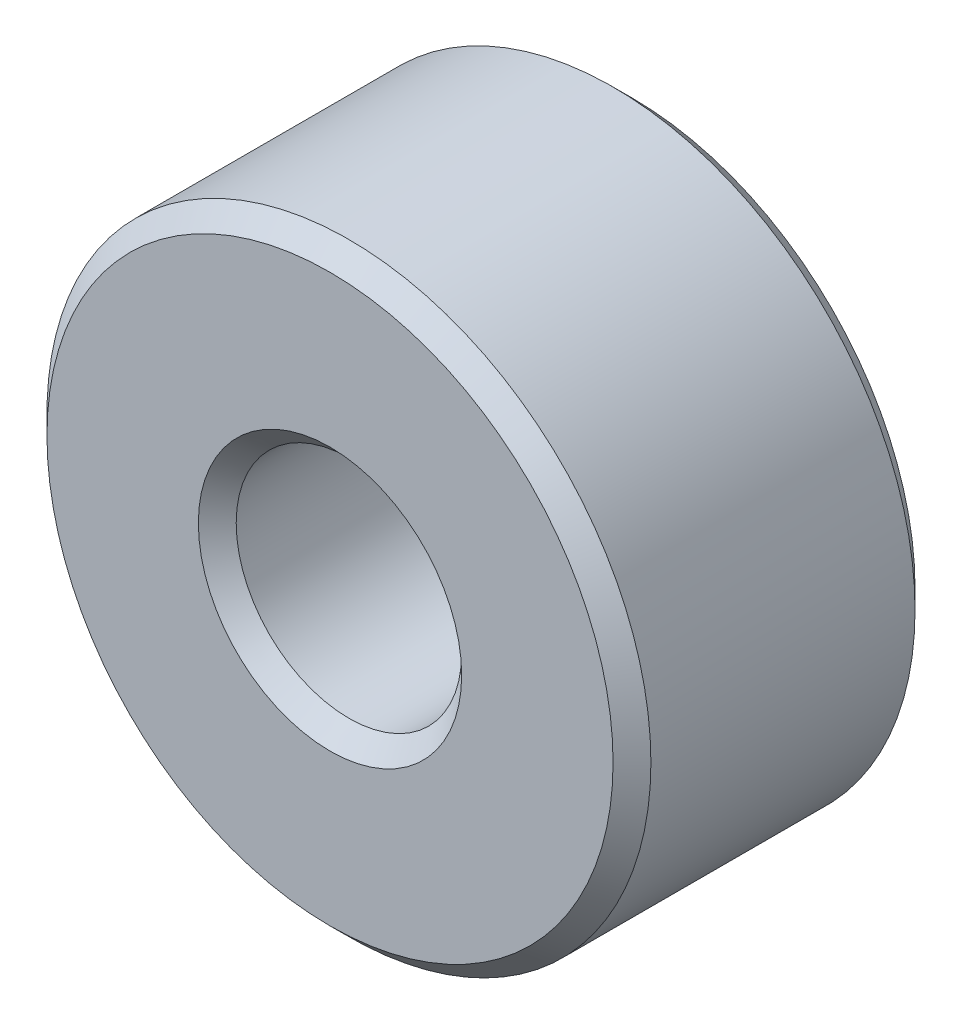
ISO-10303-21;
HEADER;
FILE_DESCRIPTION(('STEP AP214'),'2;1');
FILE_NAME('part.step','',(''),(''),'','','');
FILE_SCHEMA(('AUTOMOTIVE_DESIGN { 1 0 10303 214 1 1 1 1 }'));
ENDSEC;
DATA;
#1=APPLICATION_CONTEXT('core data for automotive mechanical design processes');
#2=APPLICATION_PROTOCOL_DEFINITION('international standard','automotive_design',2000,#1);
#3=PRODUCT_CONTEXT('',#1,'mechanical');
#4=PRODUCT('Part','Part','',(#3));
#5=PRODUCT_RELATED_PRODUCT_CATEGORY('part','',(#4));
#6=PRODUCT_DEFINITION_FORMATION('','',#4);
#7=PRODUCT_DEFINITION_CONTEXT('part definition',#1,'design');
#8=PRODUCT_DEFINITION('design','',#6,#7);
#9=PRODUCT_DEFINITION_SHAPE('','',#8);
#10=(LENGTH_UNIT() NAMED_UNIT(*) SI_UNIT(.MILLI.,.METRE.));
#11=(NAMED_UNIT(*) PLANE_ANGLE_UNIT() SI_UNIT($,.RADIAN.));
#12=(NAMED_UNIT(*) SI_UNIT($,.STERADIAN.) SOLID_ANGLE_UNIT());
#13=UNCERTAINTY_MEASURE_WITH_UNIT(LENGTH_MEASURE(1.E-05),#10,'distance_accuracy_value','');
#14=(GEOMETRIC_REPRESENTATION_CONTEXT(3) GLOBAL_UNCERTAINTY_ASSIGNED_CONTEXT((#13)) GLOBAL_UNIT_ASSIGNED_CONTEXT((#10,
#11,#12)) REPRESENTATION_CONTEXT('',''));
#15=CARTESIAN_POINT('',(0.,0.,0.));
#16=DIRECTION('',(0.,0.,1.));
#17=DIRECTION('',(1.,0.,0.));
#18=AXIS2_PLACEMENT_3D('',#15,#16,#17);
#19=CARTESIAN_POINT('',(0.,0.,-2.38125));
#20=DIRECTION('',(0.,0.,1.));
#21=DIRECTION('',(1.,0.,0.));
#22=AXIS2_PLACEMENT_3D('',#19,#20,#21);
#23=CYLINDRICAL_SURFACE('',#22,4.7625);
#24=CARTESIAN_POINT('',(0.,0.,2.0828));
#25=DIRECTION('',(0.,0.,1.));
#26=DIRECTION('',(1.,0.,0.));
#27=AXIS2_PLACEMENT_3D('',#24,#25,#26);
#28=CIRCLE('',#27,4.7625);
#29=CARTESIAN_POINT('',(4.7625,0.,2.0828));
#30=VERTEX_POINT('',#29);
#31=EDGE_CURVE('E65',#30,#30,#28,.F.);
#32=ORIENTED_EDGE('',*,*,#31,.T.);
#33=EDGE_LOOP('',(#32));
#34=FACE_BOUND('',#33,.T.);
#35=CARTESIAN_POINT('',(0.,0.,-2.0828));
#36=DIRECTION('',(0.,0.,1.));
#37=DIRECTION('',(1.,0.,0.));
#38=AXIS2_PLACEMENT_3D('',#35,#36,#37);
#39=CIRCLE('',#38,4.7625);
#40=CARTESIAN_POINT('',(4.7625,0.,-2.0828));
#41=VERTEX_POINT('',#40);
#42=EDGE_CURVE('E69',#41,#41,#39,.T.);
#43=ORIENTED_EDGE('',*,*,#42,.T.);
#44=EDGE_LOOP('',(#43));
#45=FACE_BOUND('',#44,.T.);
#46=ADVANCED_FACE('F39',(#34,#45),#23,.T.);
#47=CARTESIAN_POINT('',(0.,0.,-2.38125));
#48=DIRECTION('',(0.,0.,1.));
#49=DIRECTION('',(1.,0.,0.));
#50=AXIS2_PLACEMENT_3D('',#47,#48,#49);
#51=PLANE('',#50);
#52=CARTESIAN_POINT('',(0.,0.,-2.38125));
#53=DIRECTION('',(0.,0.,1.));
#54=DIRECTION('',(1.,0.,0.));
#55=AXIS2_PLACEMENT_3D('',#52,#53,#54);
#56=CIRCLE('',#55,4.46405);
#57=CARTESIAN_POINT('',(4.46405,0.,-2.38125));
#58=VERTEX_POINT('',#57);
#59=EDGE_CURVE('E53',#58,#58,#56,.F.);
#60=ORIENTED_EDGE('',*,*,#59,.T.);
#61=EDGE_LOOP('',(#60));
#62=FACE_BOUND('',#61,.T.);
#63=CARTESIAN_POINT('',(0.,0.,-2.38125));
#64=DIRECTION('',(0.,0.,1.));
#65=DIRECTION('',(1.,0.,0.));
#66=AXIS2_PLACEMENT_3D('',#63,#64,#65);
#67=CIRCLE('',#66,2.07645);
#68=CARTESIAN_POINT('',(-2.07645,0.,-2.38125));
#69=VERTEX_POINT('',#68);
#70=EDGE_CURVE('E59',#69,#69,#67,.T.);
#71=ORIENTED_EDGE('',*,*,#70,.T.);
#72=EDGE_LOOP('',(#71));
#73=FACE_BOUND('',#72,.T.);
#74=ADVANCED_FACE('F98',(#62,#73),#51,.F.);
#75=CARTESIAN_POINT('',(0.,0.,-2.38125));
#76=DIRECTION('',(0.,0.,1.));
#77=DIRECTION('',(1.,0.,0.));
#78=AXIS2_PLACEMENT_3D('',#75,#76,#77);
#79=CYLINDRICAL_SURFACE('',#78,1.778);
#80=CARTESIAN_POINT('',(0.,0.,2.0828));
#81=DIRECTION('',(0.,0.,1.));
#82=DIRECTION('',(1.,0.,0.));
#83=AXIS2_PLACEMENT_3D('',#80,#81,#82);
#84=CIRCLE('',#83,1.778);
#85=CARTESIAN_POINT('',(1.778,0.,2.0828));
#86=VERTEX_POINT('',#85);
#87=EDGE_CURVE('E10',#86,#86,#84,.T.);
#88=ORIENTED_EDGE('',*,*,#87,.T.);
#89=EDGE_LOOP('',(#88));
#90=FACE_BOUND('',#89,.T.);
#91=CARTESIAN_POINT('',(0.,0.,-2.0828));
#92=DIRECTION('',(0.,0.,1.));
#93=DIRECTION('',(1.,0.,0.));
#94=AXIS2_PLACEMENT_3D('',#91,#92,#93);
#95=CIRCLE('',#94,1.778);
#96=CARTESIAN_POINT('',(-1.778,0.,-2.0828));
#97=VERTEX_POINT('',#96);
#98=EDGE_CURVE('E47',#97,#97,#95,.F.);
#99=ORIENTED_EDGE('',*,*,#98,.T.);
#100=EDGE_LOOP('',(#99));
#101=FACE_BOUND('',#100,.T.);
#102=ADVANCED_FACE('F104',(#90,#101),#79,.F.);
#103=CARTESIAN_POINT('',(0.,0.,2.38125));
#104=DIRECTION('',(0.,0.,1.));
#105=DIRECTION('',(1.,0.,0.));
#106=AXIS2_PLACEMENT_3D('',#103,#104,#105);
#107=PLANE('',#106);
#108=CARTESIAN_POINT('',(0.,0.,2.38125));
#109=DIRECTION('',(0.,0.,1.));
#110=DIRECTION('',(1.,0.,0.));
#111=AXIS2_PLACEMENT_3D('',#108,#109,#110);
#112=CIRCLE('',#111,4.46405);
#113=CARTESIAN_POINT('',(4.46405,0.,2.38125));
#114=VERTEX_POINT('',#113);
#115=EDGE_CURVE('E73',#114,#114,#112,.T.);
#116=ORIENTED_EDGE('',*,*,#115,.T.);
#117=EDGE_LOOP('',(#116));
#118=FACE_BOUND('',#117,.T.);
#119=CARTESIAN_POINT('',(0.,0.,2.38125));
#120=DIRECTION('',(0.,0.,1.));
#121=DIRECTION('',(1.,0.,0.));
#122=AXIS2_PLACEMENT_3D('',#119,#120,#121);
#123=CIRCLE('',#122,2.07645);
#124=CARTESIAN_POINT('',(2.07645,0.,2.38125));
#125=VERTEX_POINT('',#124);
#126=EDGE_CURVE('E77',#125,#125,#123,.F.);
#127=ORIENTED_EDGE('',*,*,#126,.T.);
#128=EDGE_LOOP('',(#127));
#129=FACE_BOUND('',#128,.T.);
#130=ADVANCED_FACE('F83',(#118,#129),#107,.T.);
#131=CARTESIAN_POINT('',(0.,0.,2.38125));
#132=DIRECTION('',(0.,0.,-1.));
#133=DIRECTION('',(-1.,0.,0.));
#134=AXIS2_PLACEMENT_3D('',#131,#132,#133);
#135=CONICAL_SURFACE('',#134,4.46405,0.785398163397447);
#136=ORIENTED_EDGE('',*,*,#31,.F.);
#137=EDGE_LOOP('',(#136));
#138=FACE_BOUND('',#137,.T.);
#139=ORIENTED_EDGE('',*,*,#115,.F.);
#140=EDGE_LOOP('',(#139));
#141=FACE_BOUND('',#140,.T.);
#142=ADVANCED_FACE('F94',(#138,#141),#135,.T.);
#143=CARTESIAN_POINT('',(0.,0.,-2.0828));
#144=DIRECTION('',(0.,0.,1.));
#145=DIRECTION('',(1.,0.,0.));
#146=AXIS2_PLACEMENT_3D('',#143,#144,#145);
#147=CONICAL_SURFACE('',#146,4.7625,0.785398163397453);
#148=ORIENTED_EDGE('',*,*,#59,.F.);
#149=EDGE_LOOP('',(#148));
#150=FACE_BOUND('',#149,.T.);
#151=ORIENTED_EDGE('',*,*,#42,.F.);
#152=EDGE_LOOP('',(#151));
#153=FACE_BOUND('',#152,.T.);
#154=ADVANCED_FACE('F88',(#150,#153),#147,.T.);
#155=CARTESIAN_POINT('',(0.,0.,2.0828));
#156=DIRECTION('',(0.,0.,1.));
#157=DIRECTION('',(1.,0.,0.));
#158=AXIS2_PLACEMENT_3D('',#155,#156,#157);
#159=CONICAL_SURFACE('',#158,1.778,0.785398163397447);
#160=ORIENTED_EDGE('',*,*,#126,.F.);
#161=EDGE_LOOP('',(#160));
#162=FACE_BOUND('',#161,.T.);
#163=ORIENTED_EDGE('',*,*,#87,.F.);
#164=EDGE_LOOP('',(#163));
#165=FACE_BOUND('',#164,.T.);
#166=ADVANCED_FACE('F85',(#162,#165),#159,.F.);
#167=CARTESIAN_POINT('',(0.,0.,-2.38125));
#168=DIRECTION('',(0.,0.,-1.));
#169=DIRECTION('',(-1.,0.,0.));
#170=AXIS2_PLACEMENT_3D('',#167,#168,#169);
#171=CONICAL_SURFACE('',#170,2.07645,0.785398163397448);
#172=CARTESIAN_POINT('',(-1.778,0.,-2.0828));
#173=CARTESIAN_POINT('',(-1.78110885416667,0.,-2.08590885416667));
#174=CARTESIAN_POINT('',(-1.78421770833333,0.,-2.08901770833334));
#175=CARTESIAN_POINT('',(-1.79043541666667,0.,-2.09523541666667));
#176=CARTESIAN_POINT('',(-1.79354427083333,0.,-2.09834427083334));
#177=CARTESIAN_POINT('',(-1.79976197916667,0.,-2.10456197916667));
#178=CARTESIAN_POINT('',(-1.80287083333333,0.,-2.10767083333334));
#179=CARTESIAN_POINT('',(-1.80908854166667,0.,-2.11388854166667));
#180=CARTESIAN_POINT('',(-1.81219739583333,0.,-2.11699739583334));
#181=CARTESIAN_POINT('',(-1.81841510416667,0.,-2.12321510416667));
#182=CARTESIAN_POINT('',(-1.82152395833333,0.,-2.12632395833334));
#183=CARTESIAN_POINT('',(-1.82774166666667,0.,-2.13254166666667));
#184=CARTESIAN_POINT('',(-1.83085052083333,0.,-2.13565052083334));
#185=CARTESIAN_POINT('',(-1.83706822916667,0.,-2.14186822916667));
#186=CARTESIAN_POINT('',(-1.84017708333333,0.,-2.14497708333334));
#187=CARTESIAN_POINT('',(-1.84639479166667,0.,-2.15119479166667));
#188=CARTESIAN_POINT('',(-1.84950364583333,0.,-2.15430364583334));
#189=CARTESIAN_POINT('',(-1.85572135416667,0.,-2.16052135416667));
#190=CARTESIAN_POINT('',(-1.85883020833333,0.,-2.16363020833334));
#191=CARTESIAN_POINT('',(-1.86504791666667,0.,-2.16984791666667));
#192=CARTESIAN_POINT('',(-1.86815677083333,0.,-2.17295677083334));
#193=CARTESIAN_POINT('',(-1.87437447916667,0.,-2.17917447916667));
#194=CARTESIAN_POINT('',(-1.87748333333333,0.,-2.18228333333334));
#195=CARTESIAN_POINT('',(-1.88370104166667,0.,-2.18850104166667));
#196=CARTESIAN_POINT('',(-1.88680989583333,0.,-2.19160989583334));
#197=CARTESIAN_POINT('',(-1.89302760416667,0.,-2.19782760416667));
#198=CARTESIAN_POINT('',(-1.89613645833333,0.,-2.20093645833334));
#199=CARTESIAN_POINT('',(-1.90235416666667,0.,-2.20715416666667));
#200=CARTESIAN_POINT('',(-1.90546302083333,0.,-2.21026302083334));
#201=CARTESIAN_POINT('',(-1.91168072916667,0.,-2.21648072916667));
#202=CARTESIAN_POINT('',(-1.91478958333333,0.,-2.21958958333334));
#203=CARTESIAN_POINT('',(-1.92100729166667,0.,-2.22580729166667));
#204=CARTESIAN_POINT('',(-1.92411614583333,0.,-2.22891614583334));
#205=CARTESIAN_POINT('',(-1.93033385416667,0.,-2.23513385416667));
#206=CARTESIAN_POINT('',(-1.93344270833333,0.,-2.23824270833334));
#207=CARTESIAN_POINT('',(-1.93966041666667,0.,-2.24446041666667));
#208=CARTESIAN_POINT('',(-1.94276927083333,0.,-2.24756927083334));
#209=CARTESIAN_POINT('',(-1.94898697916667,0.,-2.25378697916667));
#210=CARTESIAN_POINT('',(-1.95209583333333,0.,-2.25689583333334));
#211=CARTESIAN_POINT('',(-1.95831354166667,0.,-2.26311354166667));
#212=CARTESIAN_POINT('',(-1.96142239583333,0.,-2.26622239583334));
#213=CARTESIAN_POINT('',(-1.96764010416667,0.,-2.27244010416667));
#214=CARTESIAN_POINT('',(-1.97074895833333,0.,-2.27554895833334));
#215=CARTESIAN_POINT('',(-1.97696666666667,0.,-2.28176666666667));
#216=CARTESIAN_POINT('',(-1.98007552083333,0.,-2.28487552083334));
#217=CARTESIAN_POINT('',(-1.98629322916667,0.,-2.29109322916667));
#218=CARTESIAN_POINT('',(-1.98940208333333,0.,-2.29420208333334));
#219=CARTESIAN_POINT('',(-1.99561979166667,0.,-2.30041979166667));
#220=CARTESIAN_POINT('',(-1.99872864583333,0.,-2.30352864583334));
#221=CARTESIAN_POINT('',(-2.00494635416667,0.,-2.30974635416667));
#222=CARTESIAN_POINT('',(-2.00805520833333,0.,-2.31285520833334));
#223=CARTESIAN_POINT('',(-2.01427291666667,0.,-2.31907291666667));
#224=CARTESIAN_POINT('',(-2.01738177083333,0.,-2.32218177083333));
#225=CARTESIAN_POINT('',(-2.02359947916667,0.,-2.32839947916667));
#226=CARTESIAN_POINT('',(-2.02670833333333,0.,-2.33150833333334));
#227=CARTESIAN_POINT('',(-2.03292604166667,0.,-2.33772604166667));
#228=CARTESIAN_POINT('',(-2.03603489583333,0.,-2.34083489583334));
#229=CARTESIAN_POINT('',(-2.04225260416667,0.,-2.34705260416667));
#230=CARTESIAN_POINT('',(-2.04536145833333,0.,-2.35016145833334));
#231=CARTESIAN_POINT('',(-2.05157916666667,0.,-2.35637916666667));
#232=CARTESIAN_POINT('',(-2.05468802083333,0.,-2.35948802083333));
#233=CARTESIAN_POINT('',(-2.06090572916667,0.,-2.36570572916667));
#234=CARTESIAN_POINT('',(-2.06401458333333,0.,-2.36881458333333));
#235=CARTESIAN_POINT('',(-2.07023229166667,0.,-2.37503229166667));
#236=CARTESIAN_POINT('',(-2.07334114583333,0.,-2.37814114583334));
#237=CARTESIAN_POINT('',(-2.07645,0.,-2.38125));
#238=B_SPLINE_CURVE_WITH_KNOTS('',3,(#172,#173,#174,#175,#176,#177,#178,#179,#180,#181,#182,
#183,#184,#185,#186,#187,#188,#189,#190,#191,#192,#193,#194,#195,#196,#197,#198,#199,#200,#201,
#202,#203,#204,#205,#206,#207,#208,#209,#210,#211,#212,#213,#214,#215,#216,#217,#218,#219,#220,
#221,#222,#223,#224,#225,#226,#227,#228,#229,#230,#231,#232,#233,#234,#235,#236,#237),
.UNSPECIFIED.,.F.,.F.,(4,2,2,2,2,2,2,2,2,2,2,2,2,2,2,2,2,2,2,2,2,2,2,2,2,2,2,2,2,2,2,2,4),(0.,
0.0131897511778206,0.0263795023556405,0.0395692535334611,0.0527590047112814,0.0659487558891016,
0.079138507066922,0.0923282582447421,0.105518009422563,0.118707760600383,0.131897511778203,
0.145087262956023,0.158277014133844,0.171466765311664,0.184656516489484,0.197846267667304,
0.211036018845125,0.224225770022945,0.237415521200765,0.250605272378586,0.263795023556406,
0.276984774734226,0.290174525912046,0.303364277089867,0.316554028267687,0.329743779445507,
0.342933530623327,0.356123281801148,0.369313032978968,0.382502784156788,0.395692535334608,
0.408882286512429,0.422072037690249),.UNSPECIFIED.);
#239=EDGE_CURVE('BSEAM41',#97,#69,#238,.T.);
#240=ORIENTED_EDGE('',*,*,#98,.F.);
#241=ORIENTED_EDGE('',*,*,#70,.F.);
#242=ORIENTED_EDGE('',*,*,#239,.T.);
#243=ORIENTED_EDGE('',*,*,#239,.F.);
#244=EDGE_LOOP('',(#240,#242,#241,#243));
#245=FACE_BOUND('',#244,.T.);
#246=ADVANCED_FACE('F41',(#245),#171,.F.);
#247=CLOSED_SHELL('',(#46,#74,#102,#130,#142,#154,#166,#246));
#248=MANIFOLD_SOLID_BREP('B2',#247);
#249=ADVANCED_BREP_SHAPE_REPRESENTATION('',(#18,#248),#14);
#250=SHAPE_DEFINITION_REPRESENTATION(#9,#249);
ENDSEC;
END-ISO-10303-21;
